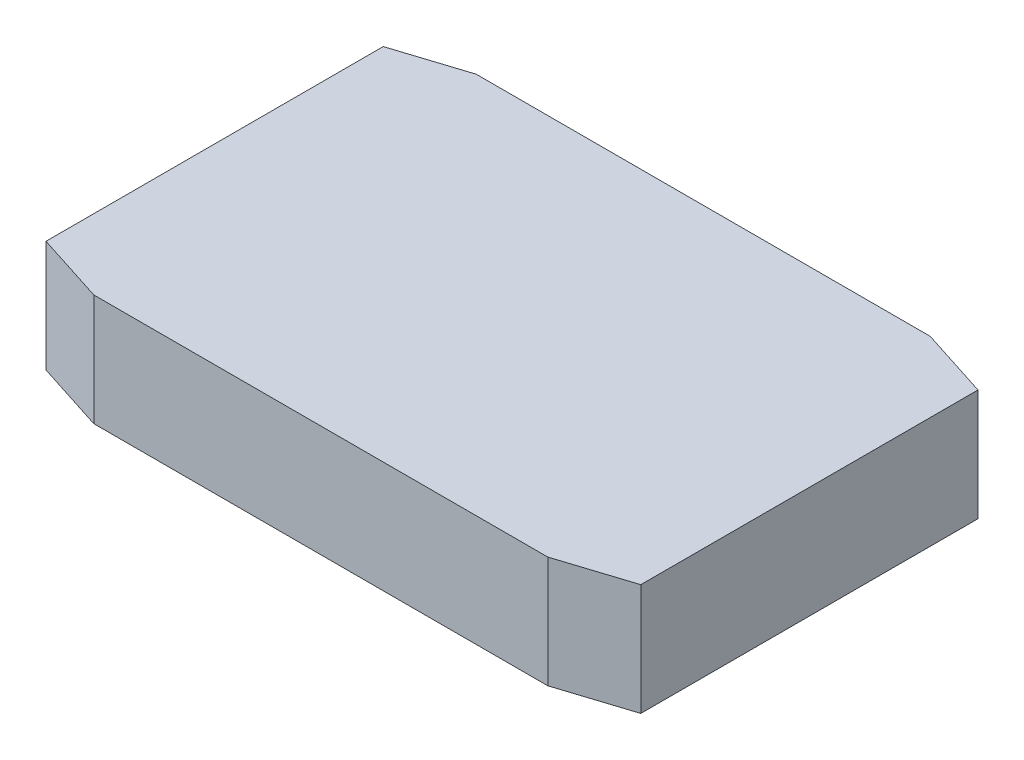
ISO-10303-21;
HEADER;
FILE_DESCRIPTION(('STEP AP214'),'2;1');
FILE_NAME('part.step','',(''),(''),'','','');
FILE_SCHEMA(('AUTOMOTIVE_DESIGN { 1 0 10303 214 1 1 1 1 }'));
ENDSEC;
DATA;
#1=APPLICATION_CONTEXT('core data for automotive mechanical design processes');
#2=APPLICATION_PROTOCOL_DEFINITION('international standard','automotive_design',2000,#1);
#3=PRODUCT_CONTEXT('',#1,'mechanical');
#4=PRODUCT('Part','Part','',(#3));
#5=PRODUCT_RELATED_PRODUCT_CATEGORY('part','',(#4));
#6=PRODUCT_DEFINITION_FORMATION('','',#4);
#7=PRODUCT_DEFINITION_CONTEXT('part definition',#1,'design');
#8=PRODUCT_DEFINITION('design','',#6,#7);
#9=PRODUCT_DEFINITION_SHAPE('','',#8);
#10=(LENGTH_UNIT() NAMED_UNIT(*) SI_UNIT(.MILLI.,.METRE.));
#11=(NAMED_UNIT(*) PLANE_ANGLE_UNIT() SI_UNIT($,.RADIAN.));
#12=(NAMED_UNIT(*) SI_UNIT($,.STERADIAN.) SOLID_ANGLE_UNIT());
#13=UNCERTAINTY_MEASURE_WITH_UNIT(LENGTH_MEASURE(1.E-05),#10,'distance_accuracy_value','');
#14=(GEOMETRIC_REPRESENTATION_CONTEXT(3) GLOBAL_UNCERTAINTY_ASSIGNED_CONTEXT((#13)) GLOBAL_UNIT_ASSIGNED_CONTEXT((#10,
#11,#12)) REPRESENTATION_CONTEXT('',''));
#15=CARTESIAN_POINT('',(0.,0.,0.));
#16=DIRECTION('',(0.,0.,1.));
#17=DIRECTION('',(1.,0.,0.));
#18=AXIS2_PLACEMENT_3D('',#15,#16,#17);
#19=CARTESIAN_POINT('',(0.,42.,0.));
#20=DIRECTION('',(1.,0.,0.));
#21=DIRECTION('',(0.,0.,-1.));
#22=AXIS2_PLACEMENT_3D('',#19,#20,#21);
#23=PLANE('',#22);
#24=DIRECTION('',(0.,0.,1.));
#25=VECTOR('',#24,1.);
#26=CARTESIAN_POINT('',(0.,42.,0.));
#27=LINE('',#26,#25);
#28=CARTESIAN_POINT('',(0.,42.,-135.5));
#29=VERTEX_POINT('',#28);
#30=CARTESIAN_POINT('',(0.,42.,-8.50000000000004));
#31=VERTEX_POINT('',#30);
#32=EDGE_CURVE('E228',#29,#31,#27,.T.);
#33=ORIENTED_EDGE('',*,*,#32,.F.);
#34=DIRECTION('',(0.,-1.,0.));
#35=VECTOR('',#34,1.);
#36=CARTESIAN_POINT('',(0.,42.,-135.5));
#37=LINE('',#36,#35);
#38=CARTESIAN_POINT('',(0.,0.,-135.5));
#39=VERTEX_POINT('',#38);
#40=EDGE_CURVE('E267',#29,#39,#37,.T.);
#41=ORIENTED_EDGE('',*,*,#40,.T.);
#42=DIRECTION('',(0.,0.,1.));
#43=VECTOR('',#42,1.);
#44=CARTESIAN_POINT('',(0.,0.,0.));
#45=LINE('',#44,#43);
#46=CARTESIAN_POINT('',(0.,0.,-8.50000000000004));
#47=VERTEX_POINT('',#46);
#48=EDGE_CURVE('E227',#39,#47,#45,.T.);
#49=ORIENTED_EDGE('',*,*,#48,.T.);
#50=DIRECTION('',(0.,1.,0.));
#51=VECTOR('',#50,1.);
#52=CARTESIAN_POINT('',(0.,42.,-8.50000000000004));
#53=LINE('',#52,#51);
#54=EDGE_CURVE('E264',#47,#31,#53,.T.);
#55=ORIENTED_EDGE('',*,*,#54,.T.);
#56=EDGE_LOOP('',(#33,#41,#49,#55));
#57=FACE_BOUND('',#56,.T.);
#58=ADVANCED_FACE('F45',(#57),#23,.F.);
#59=CARTESIAN_POINT('',(0.,42.,0.));
#60=DIRECTION('',(0.,0.,-1.));
#61=DIRECTION('',(-1.,0.,0.));
#62=AXIS2_PLACEMENT_3D('',#59,#60,#61);
#63=PLANE('',#62);
#64=DIRECTION('',(1.,0.,0.));
#65=VECTOR('',#64,1.);
#66=CARTESIAN_POINT('',(0.,0.,0.));
#67=LINE('',#66,#65);
#68=CARTESIAN_POINT('',(26.5000000000004,0.,0.));
#69=VERTEX_POINT('',#68);
#70=CARTESIAN_POINT('',(197.5,0.,0.));
#71=VERTEX_POINT('',#70);
#72=EDGE_CURVE('E240',#69,#71,#67,.T.);
#73=ORIENTED_EDGE('',*,*,#72,.T.);
#74=DIRECTION('',(0.,1.,0.));
#75=VECTOR('',#74,1.);
#76=CARTESIAN_POINT('',(197.5,42.,0.));
#77=LINE('',#76,#75);
#78=CARTESIAN_POINT('',(197.5,42.,0.));
#79=VERTEX_POINT('',#78);
#80=EDGE_CURVE('E11',#71,#79,#77,.T.);
#81=ORIENTED_EDGE('',*,*,#80,.T.);
#82=DIRECTION('',(1.,0.,0.));
#83=VECTOR('',#82,1.);
#84=CARTESIAN_POINT('',(0.,42.,0.));
#85=LINE('',#84,#83);
#86=CARTESIAN_POINT('',(26.5000000000004,42.,0.));
#87=VERTEX_POINT('',#86);
#88=EDGE_CURVE('E230',#87,#79,#85,.T.);
#89=ORIENTED_EDGE('',*,*,#88,.F.);
#90=DIRECTION('',(0.,-1.,0.));
#91=VECTOR('',#90,1.);
#92=CARTESIAN_POINT('',(26.5000000000004,42.,0.));
#93=LINE('',#92,#91);
#94=EDGE_CURVE('E261',#87,#69,#93,.T.);
#95=ORIENTED_EDGE('',*,*,#94,.T.);
#96=EDGE_LOOP('',(#73,#81,#89,#95));
#97=FACE_BOUND('',#96,.T.);
#98=ADVANCED_FACE('F309',(#97),#63,.F.);
#99=CARTESIAN_POINT('',(224.,42.,0.));
#100=DIRECTION('',(-1.,0.,0.));
#101=DIRECTION('',(0.,0.,1.));
#102=AXIS2_PLACEMENT_3D('',#99,#100,#101);
#103=PLANE('',#102);
#104=DIRECTION('',(0.,0.,-1.));
#105=VECTOR('',#104,1.);
#106=CARTESIAN_POINT('',(224.,42.,0.));
#107=LINE('',#106,#105);
#108=CARTESIAN_POINT('',(224.,42.,-8.50000000000001));
#109=VERTEX_POINT('',#108);
#110=CARTESIAN_POINT('',(224.,42.,-135.5));
#111=VERTEX_POINT('',#110);
#112=EDGE_CURVE('E233',#109,#111,#107,.T.);
#113=ORIENTED_EDGE('',*,*,#112,.F.);
#114=DIRECTION('',(0.,-1.,0.));
#115=VECTOR('',#114,1.);
#116=CARTESIAN_POINT('',(224.,42.,-8.50000000000001));
#117=LINE('',#116,#115);
#118=CARTESIAN_POINT('',(224.,0.,-8.50000000000001));
#119=VERTEX_POINT('',#118);
#120=EDGE_CURVE('E54',#109,#119,#117,.T.);
#121=ORIENTED_EDGE('',*,*,#120,.T.);
#122=DIRECTION('',(0.,0.,-1.));
#123=VECTOR('',#122,1.);
#124=CARTESIAN_POINT('',(224.,0.,0.));
#125=LINE('',#124,#123);
#126=CARTESIAN_POINT('',(224.,0.,-135.5));
#127=VERTEX_POINT('',#126);
#128=EDGE_CURVE('E242',#119,#127,#125,.T.);
#129=ORIENTED_EDGE('',*,*,#128,.T.);
#130=DIRECTION('',(0.,1.,0.));
#131=VECTOR('',#130,1.);
#132=CARTESIAN_POINT('',(224.,42.,-135.5));
#133=LINE('',#132,#131);
#134=EDGE_CURVE('E254',#127,#111,#133,.T.);
#135=ORIENTED_EDGE('',*,*,#134,.T.);
#136=EDGE_LOOP('',(#113,#121,#129,#135));
#137=FACE_BOUND('',#136,.T.);
#138=ADVANCED_FACE('F282',(#137),#103,.F.);
#139=CARTESIAN_POINT('',(0.,42.,-144.));
#140=DIRECTION('',(0.,0.,1.));
#141=DIRECTION('',(1.,0.,0.));
#142=AXIS2_PLACEMENT_3D('',#139,#140,#141);
#143=PLANE('',#142);
#144=DIRECTION('',(-1.,0.,0.));
#145=VECTOR('',#144,1.);
#146=CARTESIAN_POINT('',(0.,0.,-144.));
#147=LINE('',#146,#145);
#148=CARTESIAN_POINT('',(197.5,0.,-144.));
#149=VERTEX_POINT('',#148);
#150=CARTESIAN_POINT('',(26.5000000000003,0.,-144.));
#151=VERTEX_POINT('',#150);
#152=EDGE_CURVE('E231',#149,#151,#147,.T.);
#153=ORIENTED_EDGE('',*,*,#152,.T.);
#154=DIRECTION('',(0.,1.,0.));
#155=VECTOR('',#154,1.);
#156=CARTESIAN_POINT('',(26.5000000000003,42.,-144.));
#157=LINE('',#156,#155);
#158=CARTESIAN_POINT('',(26.5000000000003,42.,-144.));
#159=VERTEX_POINT('',#158);
#160=EDGE_CURVE('E274',#151,#159,#157,.T.);
#161=ORIENTED_EDGE('',*,*,#160,.T.);
#162=DIRECTION('',(-1.,0.,0.));
#163=VECTOR('',#162,1.);
#164=CARTESIAN_POINT('',(0.,42.,-144.));
#165=LINE('',#164,#163);
#166=CARTESIAN_POINT('',(197.5,42.,-144.));
#167=VERTEX_POINT('',#166);
#168=EDGE_CURVE('E235',#167,#159,#165,.T.);
#169=ORIENTED_EDGE('',*,*,#168,.F.);
#170=DIRECTION('',(0.,-1.,0.));
#171=VECTOR('',#170,1.);
#172=CARTESIAN_POINT('',(197.5,42.,-144.));
#173=LINE('',#172,#171);
#174=EDGE_CURVE('E238',#167,#149,#173,.T.);
#175=ORIENTED_EDGE('',*,*,#174,.T.);
#176=EDGE_LOOP('',(#153,#161,#169,#175));
#177=FACE_BOUND('',#176,.T.);
#178=ADVANCED_FACE('F297',(#177),#143,.F.);
#179=CARTESIAN_POINT('',(0.,42.,0.));
#180=DIRECTION('',(0.,-1.,0.));
#181=DIRECTION('',(0.,0.,-1.));
#182=AXIS2_PLACEMENT_3D('',#179,#180,#181);
#183=PLANE('',#182);
#184=ORIENTED_EDGE('',*,*,#168,.T.);
#185=DIRECTION('',(0.952215316531976,0.,-0.30542755435931));
#186=VECTOR('',#185,1.);
#187=CARTESIAN_POINT('',(0.,42.,-135.5));
#188=LINE('',#187,#186);
#189=EDGE_CURVE('E277',#159,#29,#188,.F.);
#190=ORIENTED_EDGE('',*,*,#189,.T.);
#191=ORIENTED_EDGE('',*,*,#32,.T.);
#192=DIRECTION('',(-0.952215316531976,0.,-0.30542755435931));
#193=VECTOR('',#192,1.);
#194=CARTESIAN_POINT('',(26.5000000000004,42.,0.));
#195=LINE('',#194,#193);
#196=EDGE_CURVE('E257',#31,#87,#195,.F.);
#197=ORIENTED_EDGE('',*,*,#196,.T.);
#198=ORIENTED_EDGE('',*,*,#88,.T.);
#199=DIRECTION('',(-0.952215316531976,0.,0.30542755435931));
#200=VECTOR('',#199,1.);
#201=CARTESIAN_POINT('',(224.,42.,-8.50000000000001));
#202=LINE('',#201,#200);
#203=EDGE_CURVE('E66',#79,#109,#202,.F.);
#204=ORIENTED_EDGE('',*,*,#203,.T.);
#205=ORIENTED_EDGE('',*,*,#112,.T.);
#206=DIRECTION('',(0.952215316531976,0.,0.30542755435931));
#207=VECTOR('',#206,1.);
#208=CARTESIAN_POINT('',(197.5,42.,-144.));
#209=LINE('',#208,#207);
#210=EDGE_CURVE('E259',#111,#167,#209,.F.);
#211=ORIENTED_EDGE('',*,*,#210,.T.);
#212=EDGE_LOOP('',(#184,#190,#191,#197,#198,#204,#205,#211));
#213=FACE_BOUND('',#212,.T.);
#214=ADVANCED_FACE('F294',(#213),#183,.F.);
#215=CARTESIAN_POINT('',(0.,0.,0.));
#216=DIRECTION('',(0.,-1.,0.));
#217=DIRECTION('',(0.,0.,-1.));
#218=AXIS2_PLACEMENT_3D('',#215,#216,#217);
#219=PLANE('',#218);
#220=DIRECTION('',(1.,0.,0.));
#221=VECTOR('',#220,1.);
#222=CARTESIAN_POINT('',(24.5,0.,-10.25));
#223=LINE('',#222,#221);
#224=CARTESIAN_POINT('',(24.5,0.,-10.25));
#225=VERTEX_POINT('',#224);
#226=CARTESIAN_POINT('',(199.5,0.,-10.25));
#227=VERTEX_POINT('',#226);
#228=EDGE_CURVE('E158',#225,#227,#223,.T.);
#229=ORIENTED_EDGE('',*,*,#228,.T.);
#230=DIRECTION('',(0.,0.,-1.));
#231=VECTOR('',#230,1.);
#232=CARTESIAN_POINT('',(199.5,0.,-10.25));
#233=LINE('',#232,#231);
#234=CARTESIAN_POINT('',(199.5,0.,-21.25));
#235=VERTEX_POINT('',#234);
#236=EDGE_CURVE('E163',#227,#235,#233,.T.);
#237=ORIENTED_EDGE('',*,*,#236,.T.);
#238=DIRECTION('',(1.,0.,0.));
#239=VECTOR('',#238,1.);
#240=CARTESIAN_POINT('',(24.5,0.,-21.25));
#241=LINE('',#240,#239);
#242=CARTESIAN_POINT('',(24.5,0.,-21.25));
#243=VERTEX_POINT('',#242);
#244=EDGE_CURVE('E185',#243,#235,#241,.T.);
#245=ORIENTED_EDGE('',*,*,#244,.F.);
#246=DIRECTION('',(0.,0.,-1.));
#247=VECTOR('',#246,1.);
#248=CARTESIAN_POINT('',(24.5,0.,-10.25));
#249=LINE('',#248,#247);
#250=EDGE_CURVE('E166',#225,#243,#249,.T.);
#251=ORIENTED_EDGE('',*,*,#250,.F.);
#252=EDGE_LOOP('',(#229,#237,#245,#251));
#253=FACE_BOUND('',#252,.T.);
#254=DIRECTION('',(0.,0.,1.));
#255=VECTOR('',#254,1.);
#256=CARTESIAN_POINT('',(24.5,0.,0.));
#257=LINE('',#256,#255);
#258=CARTESIAN_POINT('',(24.5,0.,-133.75));
#259=VERTEX_POINT('',#258);
#260=CARTESIAN_POINT('',(24.5,0.,-122.75));
#261=VERTEX_POINT('',#260);
#262=EDGE_CURVE('E169',#259,#261,#257,.T.);
#263=ORIENTED_EDGE('',*,*,#262,.T.);
#264=DIRECTION('',(1.,0.,0.));
#265=VECTOR('',#264,1.);
#266=CARTESIAN_POINT('',(0.,0.,-122.75));
#267=LINE('',#266,#265);
#268=CARTESIAN_POINT('',(199.5,0.,-122.75));
#269=VERTEX_POINT('',#268);
#270=EDGE_CURVE('E200',#261,#269,#267,.T.);
#271=ORIENTED_EDGE('',*,*,#270,.T.);
#272=DIRECTION('',(0.,0.,1.));
#273=VECTOR('',#272,1.);
#274=CARTESIAN_POINT('',(199.5,0.,0.));
#275=LINE('',#274,#273);
#276=CARTESIAN_POINT('',(199.5,0.,-133.75));
#277=VERTEX_POINT('',#276);
#278=EDGE_CURVE('E212',#277,#269,#275,.T.);
#279=ORIENTED_EDGE('',*,*,#278,.F.);
#280=DIRECTION('',(1.,0.,0.));
#281=VECTOR('',#280,1.);
#282=CARTESIAN_POINT('',(0.,0.,-133.75));
#283=LINE('',#282,#281);
#284=EDGE_CURVE('E209',#259,#277,#283,.T.);
#285=ORIENTED_EDGE('',*,*,#284,.F.);
#286=EDGE_LOOP('',(#263,#271,#279,#285));
#287=FACE_BOUND('',#286,.T.);
#288=ORIENTED_EDGE('',*,*,#48,.F.);
#289=DIRECTION('',(-0.952215316531976,0.,0.30542755435931));
#290=VECTOR('',#289,1.);
#291=CARTESIAN_POINT('',(-39.407843770174,0.,-122.859748224661));
#292=LINE('',#291,#290);
#293=EDGE_CURVE('E272',#39,#151,#292,.F.);
#294=ORIENTED_EDGE('',*,*,#293,.T.);
#295=ORIENTED_EDGE('',*,*,#152,.F.);
#296=DIRECTION('',(-0.952215316531976,0.,-0.30542755435931));
#297=VECTOR('',#296,1.);
#298=CARTESIAN_POINT('',(60.3039057456416,0.,-188.006294383473));
#299=LINE('',#298,#297);
#300=EDGE_CURVE('E251',#149,#127,#299,.F.);
#301=ORIENTED_EDGE('',*,*,#300,.T.);
#302=ORIENTED_EDGE('',*,*,#128,.F.);
#303=DIRECTION('',(0.952215316531976,0.,-0.30542755435931));
#304=VECTOR('',#303,1.);
#305=CARTESIAN_POINT('',(18.423983214977,0.,57.4394770819878));
#306=LINE('',#305,#304);
#307=EDGE_CURVE('E270',#119,#71,#306,.F.);
#308=ORIENTED_EDGE('',*,*,#307,.T.);
#309=ORIENTED_EDGE('',*,*,#72,.F.);
#310=DIRECTION('',(0.952215316531976,0.,0.30542755435931));
#311=VECTOR('',#310,1.);
#312=CARTESIAN_POINT('',(2.47207876049063,0.,-7.7070690768238));
#313=LINE('',#312,#311);
#314=EDGE_CURVE('E248',#69,#47,#313,.F.);
#315=ORIENTED_EDGE('',*,*,#314,.T.);
#316=EDGE_LOOP('',(#288,#294,#295,#301,#302,#308,#309,#315));
#317=FACE_BOUND('',#316,.T.);
#318=ADVANCED_FACE('F160',(#253,#287,#317),#219,.T.);
#319=CARTESIAN_POINT('',(24.5,-4.5,0.));
#320=DIRECTION('',(-1.,0.,0.));
#321=DIRECTION('',(0.,0.,1.));
#322=AXIS2_PLACEMENT_3D('',#319,#320,#321);
#323=PLANE('',#322);
#324=ORIENTED_EDGE('',*,*,#262,.F.);
#325=DIRECTION('',(0.,1.,0.));
#326=VECTOR('',#325,1.);
#327=CARTESIAN_POINT('',(24.5,-4.5,-133.75));
#328=LINE('',#327,#326);
#329=CARTESIAN_POINT('',(24.5,-4.5,-133.75));
#330=VERTEX_POINT('',#329);
#331=EDGE_CURVE('E224',#330,#259,#328,.T.);
#332=ORIENTED_EDGE('',*,*,#331,.F.);
#333=DIRECTION('',(0.,0.,1.));
#334=VECTOR('',#333,1.);
#335=CARTESIAN_POINT('',(24.5,-4.5,0.));
#336=LINE('',#335,#334);
#337=CARTESIAN_POINT('',(24.5,-4.5,-122.75));
#338=VERTEX_POINT('',#337);
#339=EDGE_CURVE('E196',#330,#338,#336,.T.);
#340=ORIENTED_EDGE('',*,*,#339,.T.);
#341=DIRECTION('',(0.,1.,0.));
#342=VECTOR('',#341,1.);
#343=CARTESIAN_POINT('',(24.5,-4.5,-122.75));
#344=LINE('',#343,#342);
#345=EDGE_CURVE('E207',#338,#261,#344,.T.);
#346=ORIENTED_EDGE('',*,*,#345,.T.);
#347=EDGE_LOOP('',(#324,#332,#340,#346));
#348=FACE_BOUND('',#347,.T.);
#349=ADVANCED_FACE('F410',(#348),#323,.T.);
#350=CARTESIAN_POINT('',(0.,-4.5,-133.75));
#351=DIRECTION('',(0.,0.,1.));
#352=DIRECTION('',(1.,0.,0.));
#353=AXIS2_PLACEMENT_3D('',#350,#351,#352);
#354=PLANE('',#353);
#355=ORIENTED_EDGE('',*,*,#284,.T.);
#356=DIRECTION('',(0.,1.,0.));
#357=VECTOR('',#356,1.);
#358=CARTESIAN_POINT('',(199.5,-4.5,-133.75));
#359=LINE('',#358,#357);
#360=CARTESIAN_POINT('',(199.5,-4.5,-133.75));
#361=VERTEX_POINT('',#360);
#362=EDGE_CURVE('E221',#361,#277,#359,.T.);
#363=ORIENTED_EDGE('',*,*,#362,.F.);
#364=DIRECTION('',(1.,0.,0.));
#365=VECTOR('',#364,1.);
#366=CARTESIAN_POINT('',(0.,-4.5,-133.75));
#367=LINE('',#366,#365);
#368=EDGE_CURVE('E199',#330,#361,#367,.T.);
#369=ORIENTED_EDGE('',*,*,#368,.F.);
#370=ORIENTED_EDGE('',*,*,#331,.T.);
#371=EDGE_LOOP('',(#355,#363,#369,#370));
#372=FACE_BOUND('',#371,.T.);
#373=ADVANCED_FACE('F402',(#372),#354,.F.);
#374=CARTESIAN_POINT('',(199.5,-4.5,0.));
#375=DIRECTION('',(-1.,0.,0.));
#376=DIRECTION('',(0.,0.,1.));
#377=AXIS2_PLACEMENT_3D('',#374,#375,#376);
#378=PLANE('',#377);
#379=ORIENTED_EDGE('',*,*,#278,.T.);
#380=DIRECTION('',(0.,1.,0.));
#381=VECTOR('',#380,1.);
#382=CARTESIAN_POINT('',(199.5,-4.5,-122.75));
#383=LINE('',#382,#381);
#384=CARTESIAN_POINT('',(199.5,-4.5,-122.75));
#385=VERTEX_POINT('',#384);
#386=EDGE_CURVE('E218',#385,#269,#383,.T.);
#387=ORIENTED_EDGE('',*,*,#386,.F.);
#388=DIRECTION('',(0.,0.,1.));
#389=VECTOR('',#388,1.);
#390=CARTESIAN_POINT('',(199.5,-4.5,0.));
#391=LINE('',#390,#389);
#392=EDGE_CURVE('E202',#361,#385,#391,.T.);
#393=ORIENTED_EDGE('',*,*,#392,.F.);
#394=ORIENTED_EDGE('',*,*,#362,.T.);
#395=EDGE_LOOP('',(#379,#387,#393,#394));
#396=FACE_BOUND('',#395,.T.);
#397=ADVANCED_FACE('F394',(#396),#378,.F.);
#398=CARTESIAN_POINT('',(0.,-4.5,-122.75));
#399=DIRECTION('',(0.,0.,1.));
#400=DIRECTION('',(1.,0.,0.));
#401=AXIS2_PLACEMENT_3D('',#398,#399,#400);
#402=PLANE('',#401);
#403=ORIENTED_EDGE('',*,*,#270,.F.);
#404=ORIENTED_EDGE('',*,*,#345,.F.);
#405=DIRECTION('',(1.,0.,0.));
#406=VECTOR('',#405,1.);
#407=CARTESIAN_POINT('',(0.,-4.5,-122.75));
#408=LINE('',#407,#406);
#409=EDGE_CURVE('E204',#338,#385,#408,.T.);
#410=ORIENTED_EDGE('',*,*,#409,.T.);
#411=ORIENTED_EDGE('',*,*,#386,.T.);
#412=EDGE_LOOP('',(#403,#404,#410,#411));
#413=FACE_BOUND('',#412,.T.);
#414=ADVANCED_FACE('F386',(#413),#402,.T.);
#415=CARTESIAN_POINT('',(0.,-4.5,0.));
#416=DIRECTION('',(0.,-1.,0.));
#417=DIRECTION('',(0.,0.,-1.));
#418=AXIS2_PLACEMENT_3D('',#415,#416,#417);
#419=PLANE('',#418);
#420=ORIENTED_EDGE('',*,*,#339,.F.);
#421=ORIENTED_EDGE('',*,*,#368,.T.);
#422=ORIENTED_EDGE('',*,*,#392,.T.);
#423=ORIENTED_EDGE('',*,*,#409,.F.);
#424=EDGE_LOOP('',(#420,#421,#422,#423));
#425=FACE_BOUND('',#424,.T.);
#426=ADVANCED_FACE('F379',(#425),#419,.T.);
#427=CARTESIAN_POINT('',(24.5,-4.5,-10.25));
#428=DIRECTION('',(0.,0.,1.));
#429=DIRECTION('',(1.,0.,0.));
#430=AXIS2_PLACEMENT_3D('',#427,#428,#429);
#431=PLANE('',#430);
#432=ORIENTED_EDGE('',*,*,#228,.F.);
#433=DIRECTION('',(0.,1.,0.));
#434=VECTOR('',#433,1.);
#435=CARTESIAN_POINT('',(24.5,-4.5,-10.25));
#436=LINE('',#435,#434);
#437=CARTESIAN_POINT('',(24.5,-4.5,-10.25));
#438=VERTEX_POINT('',#437);
#439=EDGE_CURVE('E468',#438,#225,#436,.T.);
#440=ORIENTED_EDGE('',*,*,#439,.F.);
#441=DIRECTION('',(1.,0.,0.));
#442=VECTOR('',#441,1.);
#443=CARTESIAN_POINT('',(24.5,-4.5,-10.25));
#444=LINE('',#443,#442);
#445=CARTESIAN_POINT('',(199.5,-4.5,-10.25));
#446=VERTEX_POINT('',#445);
#447=EDGE_CURVE('E175',#438,#446,#444,.T.);
#448=ORIENTED_EDGE('',*,*,#447,.T.);
#449=DIRECTION('',(0.,1.,0.));
#450=VECTOR('',#449,1.);
#451=CARTESIAN_POINT('',(199.5,-4.5,-10.25));
#452=LINE('',#451,#450);
#453=EDGE_CURVE('E172',#446,#227,#452,.T.);
#454=ORIENTED_EDGE('',*,*,#453,.T.);
#455=EDGE_LOOP('',(#432,#440,#448,#454));
#456=FACE_BOUND('',#455,.T.);
#457=ADVANCED_FACE('F173',(#456),#431,.T.);
#458=CARTESIAN_POINT('',(24.5,-4.5,-10.25));
#459=DIRECTION('',(1.,0.,0.));
#460=DIRECTION('',(0.,0.,-1.));
#461=AXIS2_PLACEMENT_3D('',#458,#459,#460);
#462=PLANE('',#461);
#463=ORIENTED_EDGE('',*,*,#250,.T.);
#464=DIRECTION('',(0.,1.,0.));
#465=VECTOR('',#464,1.);
#466=CARTESIAN_POINT('',(24.5,-4.5,-21.25));
#467=LINE('',#466,#465);
#468=CARTESIAN_POINT('',(24.5,-4.5,-21.25));
#469=VERTEX_POINT('',#468);
#470=EDGE_CURVE('E466',#469,#243,#467,.T.);
#471=ORIENTED_EDGE('',*,*,#470,.F.);
#472=DIRECTION('',(0.,0.,-1.));
#473=VECTOR('',#472,1.);
#474=CARTESIAN_POINT('',(24.5,-4.5,-10.25));
#475=LINE('',#474,#473);
#476=EDGE_CURVE('E179',#438,#469,#475,.T.);
#477=ORIENTED_EDGE('',*,*,#476,.F.);
#478=ORIENTED_EDGE('',*,*,#439,.T.);
#479=EDGE_LOOP('',(#463,#471,#477,#478));
#480=FACE_BOUND('',#479,.T.);
#481=ADVANCED_FACE('F364',(#480),#462,.F.);
#482=CARTESIAN_POINT('',(24.5,-4.5,-21.25));
#483=DIRECTION('',(0.,0.,1.));
#484=DIRECTION('',(1.,0.,0.));
#485=AXIS2_PLACEMENT_3D('',#482,#483,#484);
#486=PLANE('',#485);
#487=ORIENTED_EDGE('',*,*,#244,.T.);
#488=DIRECTION('',(0.,1.,0.));
#489=VECTOR('',#488,1.);
#490=CARTESIAN_POINT('',(199.5,-4.5,-21.25));
#491=LINE('',#490,#489);
#492=CARTESIAN_POINT('',(199.5,-4.5,-21.25));
#493=VERTEX_POINT('',#492);
#494=EDGE_CURVE('E180',#493,#235,#491,.T.);
#495=ORIENTED_EDGE('',*,*,#494,.F.);
#496=DIRECTION('',(1.,0.,0.));
#497=VECTOR('',#496,1.);
#498=CARTESIAN_POINT('',(24.5,-4.5,-21.25));
#499=LINE('',#498,#497);
#500=EDGE_CURVE('E191',#469,#493,#499,.T.);
#501=ORIENTED_EDGE('',*,*,#500,.F.);
#502=ORIENTED_EDGE('',*,*,#470,.T.);
#503=EDGE_LOOP('',(#487,#495,#501,#502));
#504=FACE_BOUND('',#503,.T.);
#505=ADVANCED_FACE('F357',(#504),#486,.F.);
#506=CARTESIAN_POINT('',(199.5,-4.5,-10.25));
#507=DIRECTION('',(1.,0.,0.));
#508=DIRECTION('',(0.,0.,-1.));
#509=AXIS2_PLACEMENT_3D('',#506,#507,#508);
#510=PLANE('',#509);
#511=ORIENTED_EDGE('',*,*,#236,.F.);
#512=ORIENTED_EDGE('',*,*,#453,.F.);
#513=DIRECTION('',(0.,0.,-1.));
#514=VECTOR('',#513,1.);
#515=CARTESIAN_POINT('',(199.5,-4.5,-10.25));
#516=LINE('',#515,#514);
#517=EDGE_CURVE('E193',#446,#493,#516,.T.);
#518=ORIENTED_EDGE('',*,*,#517,.T.);
#519=ORIENTED_EDGE('',*,*,#494,.T.);
#520=EDGE_LOOP('',(#511,#512,#518,#519));
#521=FACE_BOUND('',#520,.T.);
#522=ADVANCED_FACE('F182',(#521),#510,.T.);
#523=CARTESIAN_POINT('',(0.,-4.5,0.));
#524=DIRECTION('',(0.,1.,0.));
#525=DIRECTION('',(0.,0.,1.));
#526=AXIS2_PLACEMENT_3D('',#523,#524,#525);
#527=PLANE('',#526);
#528=ORIENTED_EDGE('',*,*,#447,.F.);
#529=ORIENTED_EDGE('',*,*,#476,.T.);
#530=ORIENTED_EDGE('',*,*,#500,.T.);
#531=ORIENTED_EDGE('',*,*,#517,.F.);
#532=EDGE_LOOP('',(#528,#529,#530,#531));
#533=FACE_BOUND('',#532,.T.);
#534=ADVANCED_FACE('F329',(#533),#527,.F.);
#535=CARTESIAN_POINT('',(197.5,42.,-144.));
#536=DIRECTION('',(-0.30542755435931,0.,0.952215316531976));
#537=DIRECTION('',(0.,-1.,0.));
#538=AXIS2_PLACEMENT_3D('',#535,#536,#537);
#539=PLANE('',#538);
#540=ORIENTED_EDGE('',*,*,#210,.F.);
#541=ORIENTED_EDGE('',*,*,#134,.F.);
#542=ORIENTED_EDGE('',*,*,#300,.F.);
#543=ORIENTED_EDGE('',*,*,#174,.F.);
#544=EDGE_LOOP('',(#540,#541,#542,#543));
#545=FACE_BOUND('',#544,.T.);
#546=ADVANCED_FACE('F292',(#545),#539,.F.);
#547=CARTESIAN_POINT('',(26.5000000000004,42.,0.));
#548=DIRECTION('',(0.30542755435931,0.,-0.952215316531976));
#549=DIRECTION('',(0.,-1.,0.));
#550=AXIS2_PLACEMENT_3D('',#547,#548,#549);
#551=PLANE('',#550);
#552=ORIENTED_EDGE('',*,*,#196,.F.);
#553=ORIENTED_EDGE('',*,*,#54,.F.);
#554=ORIENTED_EDGE('',*,*,#314,.F.);
#555=ORIENTED_EDGE('',*,*,#94,.F.);
#556=EDGE_LOOP('',(#552,#553,#554,#555));
#557=FACE_BOUND('',#556,.T.);
#558=ADVANCED_FACE('F308',(#557),#551,.F.);
#559=CARTESIAN_POINT('',(0.,42.,-135.5));
#560=DIRECTION('',(0.30542755435931,0.,0.952215316531976));
#561=DIRECTION('',(0.,-1.,0.));
#562=AXIS2_PLACEMENT_3D('',#559,#560,#561);
#563=PLANE('',#562);
#564=ORIENTED_EDGE('',*,*,#189,.F.);
#565=ORIENTED_EDGE('',*,*,#160,.F.);
#566=ORIENTED_EDGE('',*,*,#293,.F.);
#567=ORIENTED_EDGE('',*,*,#40,.F.);
#568=EDGE_LOOP('',(#564,#565,#566,#567));
#569=FACE_BOUND('',#568,.T.);
#570=ADVANCED_FACE('F300',(#569),#563,.F.);
#571=CARTESIAN_POINT('',(224.,42.,-8.50000000000001));
#572=DIRECTION('',(-0.30542755435931,0.,-0.952215316531976));
#573=DIRECTION('',(0.,-1.,0.));
#574=AXIS2_PLACEMENT_3D('',#571,#572,#573);
#575=PLANE('',#574);
#576=ORIENTED_EDGE('',*,*,#203,.F.);
#577=ORIENTED_EDGE('',*,*,#80,.F.);
#578=ORIENTED_EDGE('',*,*,#307,.F.);
#579=ORIENTED_EDGE('',*,*,#120,.F.);
#580=EDGE_LOOP('',(#576,#577,#578,#579));
#581=FACE_BOUND('',#580,.T.);
#582=ADVANCED_FACE('F48',(#581),#575,.F.);
#583=CLOSED_SHELL('',(#58,#98,#138,#178,#214,#318,#349,#373,#397,#414,#426,#457,#481,#505,#522,
#534,#546,#558,#570,#582));
#584=MANIFOLD_SOLID_BREP('B2',#583);
#585=ADVANCED_BREP_SHAPE_REPRESENTATION('',(#18,#584),#14);
#586=SHAPE_DEFINITION_REPRESENTATION(#9,#585);
ENDSEC;
END-ISO-10303-21;
